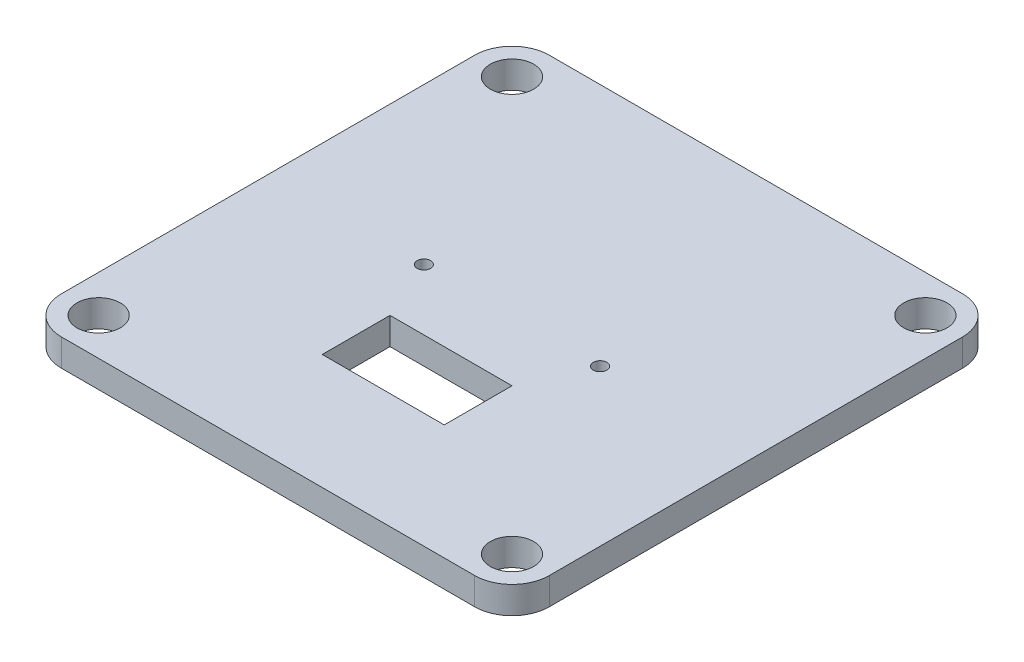
ISO-10303-21;
HEADER;
FILE_DESCRIPTION(('STEP AP214'),'2;1');
FILE_NAME('part.step','',(''),(''),'','','');
FILE_SCHEMA(('AUTOMOTIVE_DESIGN { 1 0 10303 214 1 1 1 1 }'));
ENDSEC;
DATA;
#1=APPLICATION_CONTEXT('core data for automotive mechanical design processes');
#2=APPLICATION_PROTOCOL_DEFINITION('international standard','automotive_design',2000,#1);
#3=PRODUCT_CONTEXT('',#1,'mechanical');
#4=PRODUCT('Part','Part','',(#3));
#5=PRODUCT_RELATED_PRODUCT_CATEGORY('part','',(#4));
#6=PRODUCT_DEFINITION_FORMATION('','',#4);
#7=PRODUCT_DEFINITION_CONTEXT('part definition',#1,'design');
#8=PRODUCT_DEFINITION('design','',#6,#7);
#9=PRODUCT_DEFINITION_SHAPE('','',#8);
#10=(LENGTH_UNIT() NAMED_UNIT(*) SI_UNIT(.MILLI.,.METRE.));
#11=(NAMED_UNIT(*) PLANE_ANGLE_UNIT() SI_UNIT($,.RADIAN.));
#12=(NAMED_UNIT(*) SI_UNIT($,.STERADIAN.) SOLID_ANGLE_UNIT());
#13=UNCERTAINTY_MEASURE_WITH_UNIT(LENGTH_MEASURE(1.E-05),#10,'distance_accuracy_value','');
#14=(GEOMETRIC_REPRESENTATION_CONTEXT(3) GLOBAL_UNCERTAINTY_ASSIGNED_CONTEXT((#13)) GLOBAL_UNIT_ASSIGNED_CONTEXT((#10,
#11,#12)) REPRESENTATION_CONTEXT('',''));
#15=CARTESIAN_POINT('',(0.,0.,0.));
#16=DIRECTION('',(0.,0.,1.));
#17=DIRECTION('',(1.,0.,0.));
#18=AXIS2_PLACEMENT_3D('',#15,#16,#17);
#19=CARTESIAN_POINT('',(15.25,2.,15.25));
#20=DIRECTION('',(0.,1.,0.));
#21=DIRECTION('',(0.,0.,1.));
#22=AXIS2_PLACEMENT_3D('',#19,#20,#21);
#23=PLANE('',#22);
#24=CARTESIAN_POINT('',(-15.25,2.,-15.25));
#25=DIRECTION('',(0.,1.,0.));
#26=DIRECTION('',(0.,0.,1.));
#27=AXIS2_PLACEMENT_3D('',#24,#25,#26);
#28=CIRCLE('',#27,1.6);
#29=CARTESIAN_POINT('',(-15.25,2.,-13.65));
#30=VERTEX_POINT('',#29);
#31=EDGE_CURVE('E170',#30,#30,#28,.T.);
#32=ORIENTED_EDGE('',*,*,#31,.F.);
#33=EDGE_LOOP('',(#32));
#34=FACE_BOUND('',#33,.T.);
#35=CARTESIAN_POINT('',(15.25,2.,15.25));
#36=DIRECTION('',(0.,1.,0.));
#37=DIRECTION('',(0.,0.,1.));
#38=AXIS2_PLACEMENT_3D('',#35,#36,#37);
#39=CIRCLE('',#38,1.6);
#40=CARTESIAN_POINT('',(15.25,2.,16.85));
#41=VERTEX_POINT('',#40);
#42=EDGE_CURVE('E182',#41,#41,#39,.T.);
#43=ORIENTED_EDGE('',*,*,#42,.F.);
#44=EDGE_LOOP('',(#43));
#45=FACE_BOUND('',#44,.T.);
#46=CARTESIAN_POINT('',(15.25,2.,-15.25));
#47=DIRECTION('',(0.,1.,0.));
#48=DIRECTION('',(0.,0.,1.));
#49=AXIS2_PLACEMENT_3D('',#46,#47,#48);
#50=CIRCLE('',#49,1.6);
#51=CARTESIAN_POINT('',(15.25,2.,-13.65));
#52=VERTEX_POINT('',#51);
#53=EDGE_CURVE('E194',#52,#52,#50,.T.);
#54=ORIENTED_EDGE('',*,*,#53,.F.);
#55=EDGE_LOOP('',(#54));
#56=FACE_BOUND('',#55,.T.);
#57=CARTESIAN_POINT('',(15.25,2.,15.25));
#58=DIRECTION('',(0.,1.,0.));
#59=DIRECTION('',(0.,0.,1.));
#60=AXIS2_PLACEMENT_3D('',#57,#58,#59);
#61=CIRCLE('',#60,2.75);
#62=CARTESIAN_POINT('',(15.25,2.,18.));
#63=VERTEX_POINT('',#62);
#64=CARTESIAN_POINT('',(18.,2.,15.25));
#65=VERTEX_POINT('',#64);
#66=EDGE_CURVE('E200',#63,#65,#61,.T.);
#67=ORIENTED_EDGE('',*,*,#66,.T.);
#68=DIRECTION('',(0.,0.,-1.));
#69=VECTOR('',#68,1.);
#70=CARTESIAN_POINT('',(18.,2.,15.25));
#71=LINE('',#70,#69);
#72=CARTESIAN_POINT('',(18.,2.,-15.25));
#73=VERTEX_POINT('',#72);
#74=EDGE_CURVE('E203',#65,#73,#71,.T.);
#75=ORIENTED_EDGE('',*,*,#74,.T.);
#76=CARTESIAN_POINT('',(15.25,2.,-15.25));
#77=DIRECTION('',(0.,1.,0.));
#78=DIRECTION('',(0.,0.,-1.));
#79=AXIS2_PLACEMENT_3D('',#76,#77,#78);
#80=CIRCLE('',#79,2.75);
#81=CARTESIAN_POINT('',(15.25,2.,-18.));
#82=VERTEX_POINT('',#81);
#83=EDGE_CURVE('E206',#73,#82,#80,.T.);
#84=ORIENTED_EDGE('',*,*,#83,.T.);
#85=DIRECTION('',(-1.,0.,0.));
#86=VECTOR('',#85,1.);
#87=CARTESIAN_POINT('',(-15.25,2.,-18.));
#88=LINE('',#87,#86);
#89=CARTESIAN_POINT('',(-15.25,2.,-18.));
#90=VERTEX_POINT('',#89);
#91=EDGE_CURVE('E208',#82,#90,#88,.T.);
#92=ORIENTED_EDGE('',*,*,#91,.T.);
#93=CARTESIAN_POINT('',(-15.25,2.,-15.25));
#94=DIRECTION('',(0.,1.,0.));
#95=DIRECTION('',(0.,0.,-1.));
#96=AXIS2_PLACEMENT_3D('',#93,#94,#95);
#97=CIRCLE('',#96,2.75);
#98=CARTESIAN_POINT('',(-18.,2.,-15.25));
#99=VERTEX_POINT('',#98);
#100=EDGE_CURVE('E210',#90,#99,#97,.T.);
#101=ORIENTED_EDGE('',*,*,#100,.T.);
#102=DIRECTION('',(0.,0.,1.));
#103=VECTOR('',#102,1.);
#104=CARTESIAN_POINT('',(-18.,2.,15.25));
#105=LINE('',#104,#103);
#106=CARTESIAN_POINT('',(-18.,2.,15.25));
#107=VERTEX_POINT('',#106);
#108=EDGE_CURVE('E212',#99,#107,#105,.T.);
#109=ORIENTED_EDGE('',*,*,#108,.T.);
#110=CARTESIAN_POINT('',(-15.25,2.,15.25));
#111=DIRECTION('',(0.,1.,0.));
#112=DIRECTION('',(0.,0.,-1.));
#113=AXIS2_PLACEMENT_3D('',#110,#111,#112);
#114=CIRCLE('',#113,2.75);
#115=CARTESIAN_POINT('',(-15.25,2.,18.));
#116=VERTEX_POINT('',#115);
#117=EDGE_CURVE('E214',#107,#116,#114,.T.);
#118=ORIENTED_EDGE('',*,*,#117,.T.);
#119=DIRECTION('',(1.,0.,0.));
#120=VECTOR('',#119,1.);
#121=CARTESIAN_POINT('',(-15.25,2.,18.));
#122=LINE('',#121,#120);
#123=EDGE_CURVE('E216',#116,#63,#122,.T.);
#124=ORIENTED_EDGE('',*,*,#123,.T.);
#125=EDGE_LOOP('',(#67,#75,#84,#92,#101,#109,#118,#124));
#126=FACE_BOUND('',#125,.T.);
#127=CARTESIAN_POINT('',(-6.5,2.,0.));
#128=DIRECTION('',(0.,1.,0.));
#129=DIRECTION('',(0.,0.,1.));
#130=AXIS2_PLACEMENT_3D('',#127,#128,#129);
#131=CIRCLE('',#130,0.5);
#132=CARTESIAN_POINT('',(-6.5,2.,0.500000000000005));
#133=VERTEX_POINT('',#132);
#134=EDGE_CURVE('E188',#133,#133,#131,.T.);
#135=ORIENTED_EDGE('',*,*,#134,.F.);
#136=EDGE_LOOP('',(#135));
#137=FACE_BOUND('',#136,.T.);
#138=CARTESIAN_POINT('',(-15.25,2.,15.25));
#139=DIRECTION('',(0.,1.,0.));
#140=DIRECTION('',(0.,0.,1.));
#141=AXIS2_PLACEMENT_3D('',#138,#139,#140);
#142=CIRCLE('',#141,1.6);
#143=CARTESIAN_POINT('',(-15.25,2.,16.85));
#144=VERTEX_POINT('',#143);
#145=EDGE_CURVE('E176',#144,#144,#142,.T.);
#146=ORIENTED_EDGE('',*,*,#145,.F.);
#147=EDGE_LOOP('',(#146));
#148=FACE_BOUND('',#147,.T.);
#149=CARTESIAN_POINT('',(6.5,2.,0.));
#150=DIRECTION('',(0.,1.,0.));
#151=DIRECTION('',(0.,0.,-1.));
#152=AXIS2_PLACEMENT_3D('',#149,#150,#151);
#153=CIRCLE('',#152,0.5);
#154=CARTESIAN_POINT('',(6.5,2.,-0.499999999999994));
#155=VERTEX_POINT('',#154);
#156=EDGE_CURVE('E164',#155,#155,#153,.T.);
#157=ORIENTED_EDGE('',*,*,#156,.F.);
#158=EDGE_LOOP('',(#157));
#159=FACE_BOUND('',#158,.T.);
#160=DIRECTION('',(1.,0.,0.));
#161=VECTOR('',#160,1.);
#162=CARTESIAN_POINT('',(-4.5,2.,9.50000000000001));
#163=LINE('',#162,#161);
#164=CARTESIAN_POINT('',(-4.5,2.,9.50000000000001));
#165=VERTEX_POINT('',#164);
#166=CARTESIAN_POINT('',(4.5,2.,9.50000000000001));
#167=VERTEX_POINT('',#166);
#168=EDGE_CURVE('E136',#165,#167,#163,.T.);
#169=ORIENTED_EDGE('',*,*,#168,.F.);
#170=DIRECTION('',(0.,0.,1.));
#171=VECTOR('',#170,1.);
#172=CARTESIAN_POINT('',(-4.5,2.,4.50000000000001));
#173=LINE('',#172,#171);
#174=CARTESIAN_POINT('',(-4.5,2.,4.50000000000001));
#175=VERTEX_POINT('',#174);
#176=EDGE_CURVE('E128',#175,#165,#173,.T.);
#177=ORIENTED_EDGE('',*,*,#176,.F.);
#178=DIRECTION('',(-1.,0.,0.));
#179=VECTOR('',#178,1.);
#180=CARTESIAN_POINT('',(-4.5,2.,4.50000000000001));
#181=LINE('',#180,#179);
#182=CARTESIAN_POINT('',(4.5,2.,4.50000000000001));
#183=VERTEX_POINT('',#182);
#184=EDGE_CURVE('E150',#183,#175,#181,.T.);
#185=ORIENTED_EDGE('',*,*,#184,.F.);
#186=DIRECTION('',(0.,0.,-1.));
#187=VECTOR('',#186,1.);
#188=CARTESIAN_POINT('',(4.5,2.,4.50000000000001));
#189=LINE('',#188,#187);
#190=EDGE_CURVE('E148',#167,#183,#189,.T.);
#191=ORIENTED_EDGE('',*,*,#190,.F.);
#192=EDGE_LOOP('',(#169,#177,#185,#191));
#193=FACE_BOUND('',#192,.T.);
#194=ADVANCED_FACE('F39',(#34,#45,#56,#126,#137,#148,#159,#193),#23,.T.);
#195=CARTESIAN_POINT('',(15.25,0.,15.25));
#196=DIRECTION('',(0.,1.,0.));
#197=DIRECTION('',(0.,0.,1.));
#198=AXIS2_PLACEMENT_3D('',#195,#196,#197);
#199=PLANE('',#198);
#200=CARTESIAN_POINT('',(6.5,0.,0.));
#201=DIRECTION('',(0.,1.,0.));
#202=DIRECTION('',(0.,0.,-1.));
#203=AXIS2_PLACEMENT_3D('',#200,#201,#202);
#204=CIRCLE('',#203,0.5);
#205=CARTESIAN_POINT('',(6.5,0.,-0.499999999999994));
#206=VERTEX_POINT('',#205);
#207=EDGE_CURVE('E144',#206,#206,#204,.T.);
#208=ORIENTED_EDGE('',*,*,#207,.T.);
#209=EDGE_LOOP('',(#208));
#210=FACE_BOUND('',#209,.T.);
#211=CARTESIAN_POINT('',(-15.25,0.,-15.25));
#212=DIRECTION('',(0.,1.,0.));
#213=DIRECTION('',(0.,0.,1.));
#214=AXIS2_PLACEMENT_3D('',#211,#212,#213);
#215=CIRCLE('',#214,1.6);
#216=CARTESIAN_POINT('',(-15.25,0.,-13.65));
#217=VERTEX_POINT('',#216);
#218=EDGE_CURVE('E167',#217,#217,#215,.T.);
#219=ORIENTED_EDGE('',*,*,#218,.T.);
#220=EDGE_LOOP('',(#219));
#221=FACE_BOUND('',#220,.T.);
#222=CARTESIAN_POINT('',(-15.25,0.,15.25));
#223=DIRECTION('',(0.,1.,0.));
#224=DIRECTION('',(0.,0.,1.));
#225=AXIS2_PLACEMENT_3D('',#222,#223,#224);
#226=CIRCLE('',#225,1.6);
#227=CARTESIAN_POINT('',(-15.25,0.,16.85));
#228=VERTEX_POINT('',#227);
#229=EDGE_CURVE('E173',#228,#228,#226,.T.);
#230=ORIENTED_EDGE('',*,*,#229,.T.);
#231=EDGE_LOOP('',(#230));
#232=FACE_BOUND('',#231,.T.);
#233=CARTESIAN_POINT('',(15.25,0.,15.25));
#234=DIRECTION('',(0.,1.,0.));
#235=DIRECTION('',(0.,0.,1.));
#236=AXIS2_PLACEMENT_3D('',#233,#234,#235);
#237=CIRCLE('',#236,1.6);
#238=CARTESIAN_POINT('',(15.25,0.,16.85));
#239=VERTEX_POINT('',#238);
#240=EDGE_CURVE('E179',#239,#239,#237,.T.);
#241=ORIENTED_EDGE('',*,*,#240,.T.);
#242=EDGE_LOOP('',(#241));
#243=FACE_BOUND('',#242,.T.);
#244=CARTESIAN_POINT('',(-6.5,0.,0.));
#245=DIRECTION('',(0.,1.,0.));
#246=DIRECTION('',(0.,0.,1.));
#247=AXIS2_PLACEMENT_3D('',#244,#245,#246);
#248=CIRCLE('',#247,0.5);
#249=CARTESIAN_POINT('',(-6.5,0.,0.500000000000005));
#250=VERTEX_POINT('',#249);
#251=EDGE_CURVE('E185',#250,#250,#248,.T.);
#252=ORIENTED_EDGE('',*,*,#251,.T.);
#253=EDGE_LOOP('',(#252));
#254=FACE_BOUND('',#253,.T.);
#255=CARTESIAN_POINT('',(15.25,0.,-15.25));
#256=DIRECTION('',(0.,1.,0.));
#257=DIRECTION('',(0.,0.,1.));
#258=AXIS2_PLACEMENT_3D('',#255,#256,#257);
#259=CIRCLE('',#258,1.6);
#260=CARTESIAN_POINT('',(15.25,0.,-13.65));
#261=VERTEX_POINT('',#260);
#262=EDGE_CURVE('E191',#261,#261,#259,.T.);
#263=ORIENTED_EDGE('',*,*,#262,.T.);
#264=EDGE_LOOP('',(#263));
#265=FACE_BOUND('',#264,.T.);
#266=CARTESIAN_POINT('',(15.25,0.,15.25));
#267=DIRECTION('',(0.,1.,0.));
#268=DIRECTION('',(0.,0.,1.));
#269=AXIS2_PLACEMENT_3D('',#266,#267,#268);
#270=CIRCLE('',#269,2.75);
#271=CARTESIAN_POINT('',(15.25,0.,18.));
#272=VERTEX_POINT('',#271);
#273=CARTESIAN_POINT('',(18.,0.,15.25));
#274=VERTEX_POINT('',#273);
#275=EDGE_CURVE('E197',#272,#274,#270,.T.);
#276=ORIENTED_EDGE('',*,*,#275,.F.);
#277=DIRECTION('',(1.,0.,0.));
#278=VECTOR('',#277,1.);
#279=CARTESIAN_POINT('',(-15.25,0.,18.));
#280=LINE('',#279,#278);
#281=CARTESIAN_POINT('',(-15.25,0.,18.));
#282=VERTEX_POINT('',#281);
#283=EDGE_CURVE('E204',#282,#272,#280,.T.);
#284=ORIENTED_EDGE('',*,*,#283,.F.);
#285=CARTESIAN_POINT('',(-15.25,0.,15.25));
#286=DIRECTION('',(0.,1.,0.));
#287=DIRECTION('',(0.,0.,-1.));
#288=AXIS2_PLACEMENT_3D('',#285,#286,#287);
#289=CIRCLE('',#288,2.75);
#290=CARTESIAN_POINT('',(-18.,0.,15.25));
#291=VERTEX_POINT('',#290);
#292=EDGE_CURVE('E231',#291,#282,#289,.T.);
#293=ORIENTED_EDGE('',*,*,#292,.F.);
#294=DIRECTION('',(0.,0.,1.));
#295=VECTOR('',#294,1.);
#296=CARTESIAN_POINT('',(-18.,0.,15.25));
#297=LINE('',#296,#295);
#298=CARTESIAN_POINT('',(-18.,0.,-15.25));
#299=VERTEX_POINT('',#298);
#300=EDGE_CURVE('E229',#299,#291,#297,.T.);
#301=ORIENTED_EDGE('',*,*,#300,.F.);
#302=CARTESIAN_POINT('',(-15.25,0.,-15.25));
#303=DIRECTION('',(0.,1.,0.));
#304=DIRECTION('',(0.,0.,-1.));
#305=AXIS2_PLACEMENT_3D('',#302,#303,#304);
#306=CIRCLE('',#305,2.75);
#307=CARTESIAN_POINT('',(-15.25,0.,-18.));
#308=VERTEX_POINT('',#307);
#309=EDGE_CURVE('E227',#308,#299,#306,.T.);
#310=ORIENTED_EDGE('',*,*,#309,.F.);
#311=DIRECTION('',(-1.,0.,0.));
#312=VECTOR('',#311,1.);
#313=CARTESIAN_POINT('',(-15.25,0.,-18.));
#314=LINE('',#313,#312);
#315=CARTESIAN_POINT('',(15.25,0.,-18.));
#316=VERTEX_POINT('',#315);
#317=EDGE_CURVE('E225',#316,#308,#314,.T.);
#318=ORIENTED_EDGE('',*,*,#317,.F.);
#319=CARTESIAN_POINT('',(15.25,0.,-15.25));
#320=DIRECTION('',(0.,1.,0.));
#321=DIRECTION('',(0.,0.,-1.));
#322=AXIS2_PLACEMENT_3D('',#319,#320,#321);
#323=CIRCLE('',#322,2.75);
#324=CARTESIAN_POINT('',(18.,0.,-15.25));
#325=VERTEX_POINT('',#324);
#326=EDGE_CURVE('E223',#325,#316,#323,.T.);
#327=ORIENTED_EDGE('',*,*,#326,.F.);
#328=DIRECTION('',(0.,0.,-1.));
#329=VECTOR('',#328,1.);
#330=CARTESIAN_POINT('',(18.,0.,15.25));
#331=LINE('',#330,#329);
#332=EDGE_CURVE('E221',#274,#325,#331,.T.);
#333=ORIENTED_EDGE('',*,*,#332,.F.);
#334=EDGE_LOOP('',(#276,#284,#293,#301,#310,#318,#327,#333));
#335=FACE_BOUND('',#334,.T.);
#336=DIRECTION('',(0.,0.,1.));
#337=VECTOR('',#336,1.);
#338=CARTESIAN_POINT('',(-4.5,0.,4.50000000000001));
#339=LINE('',#338,#337);
#340=CARTESIAN_POINT('',(-4.5,0.,4.50000000000001));
#341=VERTEX_POINT('',#340);
#342=CARTESIAN_POINT('',(-4.5,0.,9.50000000000001));
#343=VERTEX_POINT('',#342);
#344=EDGE_CURVE('E62',#341,#343,#339,.T.);
#345=ORIENTED_EDGE('',*,*,#344,.T.);
#346=DIRECTION('',(1.,0.,0.));
#347=VECTOR('',#346,1.);
#348=CARTESIAN_POINT('',(-4.5,0.,9.50000000000001));
#349=LINE('',#348,#347);
#350=CARTESIAN_POINT('',(4.5,0.,9.50000000000001));
#351=VERTEX_POINT('',#350);
#352=EDGE_CURVE('E143',#343,#351,#349,.T.);
#353=ORIENTED_EDGE('',*,*,#352,.T.);
#354=DIRECTION('',(0.,0.,-1.));
#355=VECTOR('',#354,1.);
#356=CARTESIAN_POINT('',(4.5,0.,4.50000000000001));
#357=LINE('',#356,#355);
#358=CARTESIAN_POINT('',(4.5,0.,4.50000000000001));
#359=VERTEX_POINT('',#358);
#360=EDGE_CURVE('E156',#351,#359,#357,.T.);
#361=ORIENTED_EDGE('',*,*,#360,.T.);
#362=DIRECTION('',(-1.,0.,0.));
#363=VECTOR('',#362,1.);
#364=CARTESIAN_POINT('',(-4.5,0.,4.50000000000001));
#365=LINE('',#364,#363);
#366=EDGE_CURVE('E137',#359,#341,#365,.T.);
#367=ORIENTED_EDGE('',*,*,#366,.T.);
#368=EDGE_LOOP('',(#345,#353,#361,#367));
#369=FACE_BOUND('',#368,.T.);
#370=ADVANCED_FACE('F261',(#210,#221,#232,#243,#254,#265,#335,#369),#199,.F.);
#371=CARTESIAN_POINT('',(15.25,2.,15.25));
#372=DIRECTION('',(0.,-1.,0.));
#373=DIRECTION('',(0.,0.,-1.));
#374=AXIS2_PLACEMENT_3D('',#371,#372,#373);
#375=CYLINDRICAL_SURFACE('',#374,2.75);
#376=ORIENTED_EDGE('',*,*,#275,.T.);
#377=DIRECTION('',(0.,-1.,0.));
#378=VECTOR('',#377,1.);
#379=CARTESIAN_POINT('',(18.,2.,15.25));
#380=LINE('',#379,#378);
#381=EDGE_CURVE('E11',#65,#274,#380,.T.);
#382=ORIENTED_EDGE('',*,*,#381,.F.);
#383=ORIENTED_EDGE('',*,*,#66,.F.);
#384=DIRECTION('',(0.,-1.,0.));
#385=VECTOR('',#384,1.);
#386=CARTESIAN_POINT('',(15.25,2.,18.));
#387=LINE('',#386,#385);
#388=EDGE_CURVE('E218',#63,#272,#387,.T.);
#389=ORIENTED_EDGE('',*,*,#388,.T.);
#390=EDGE_LOOP('',(#376,#382,#383,#389));
#391=FACE_BOUND('',#390,.T.);
#392=ADVANCED_FACE('F41',(#391),#375,.T.);
#393=CARTESIAN_POINT('',(18.,2.,15.25));
#394=DIRECTION('',(-1.,0.,0.));
#395=DIRECTION('',(0.,0.,1.));
#396=AXIS2_PLACEMENT_3D('',#393,#394,#395);
#397=PLANE('',#396);
#398=ORIENTED_EDGE('',*,*,#332,.T.);
#399=DIRECTION('',(0.,-1.,0.));
#400=VECTOR('',#399,1.);
#401=CARTESIAN_POINT('',(18.,2.,-15.25));
#402=LINE('',#401,#400);
#403=EDGE_CURVE('E47',#73,#325,#402,.T.);
#404=ORIENTED_EDGE('',*,*,#403,.F.);
#405=ORIENTED_EDGE('',*,*,#74,.F.);
#406=ORIENTED_EDGE('',*,*,#381,.T.);
#407=EDGE_LOOP('',(#398,#404,#405,#406));
#408=FACE_BOUND('',#407,.T.);
#409=ADVANCED_FACE('F279',(#408),#397,.F.);
#410=CARTESIAN_POINT('',(15.25,2.,-15.25));
#411=DIRECTION('',(0.,-1.,0.));
#412=DIRECTION('',(0.,0.,-1.));
#413=AXIS2_PLACEMENT_3D('',#410,#411,#412);
#414=CYLINDRICAL_SURFACE('',#413,2.75);
#415=ORIENTED_EDGE('',*,*,#326,.T.);
#416=DIRECTION('',(0.,-1.,0.));
#417=VECTOR('',#416,1.);
#418=CARTESIAN_POINT('',(15.25,2.,-18.));
#419=LINE('',#418,#417);
#420=EDGE_CURVE('E248',#82,#316,#419,.T.);
#421=ORIENTED_EDGE('',*,*,#420,.F.);
#422=ORIENTED_EDGE('',*,*,#83,.F.);
#423=ORIENTED_EDGE('',*,*,#403,.T.);
#424=EDGE_LOOP('',(#415,#421,#422,#423));
#425=FACE_BOUND('',#424,.T.);
#426=ADVANCED_FACE('F255',(#425),#414,.T.);
#427=CARTESIAN_POINT('',(-15.25,2.,-18.));
#428=DIRECTION('',(0.,0.,1.));
#429=DIRECTION('',(1.,0.,0.));
#430=AXIS2_PLACEMENT_3D('',#427,#428,#429);
#431=PLANE('',#430);
#432=ORIENTED_EDGE('',*,*,#317,.T.);
#433=DIRECTION('',(0.,-1.,0.));
#434=VECTOR('',#433,1.);
#435=CARTESIAN_POINT('',(-15.25,2.,-18.));
#436=LINE('',#435,#434);
#437=EDGE_CURVE('E245',#90,#308,#436,.T.);
#438=ORIENTED_EDGE('',*,*,#437,.F.);
#439=ORIENTED_EDGE('',*,*,#91,.F.);
#440=ORIENTED_EDGE('',*,*,#420,.T.);
#441=EDGE_LOOP('',(#432,#438,#439,#440));
#442=FACE_BOUND('',#441,.T.);
#443=ADVANCED_FACE('F267',(#442),#431,.F.);
#444=CARTESIAN_POINT('',(-15.25,2.,-15.25));
#445=DIRECTION('',(0.,-1.,0.));
#446=DIRECTION('',(0.,0.,-1.));
#447=AXIS2_PLACEMENT_3D('',#444,#445,#446);
#448=CYLINDRICAL_SURFACE('',#447,2.75);
#449=ORIENTED_EDGE('',*,*,#309,.T.);
#450=DIRECTION('',(0.,-1.,0.));
#451=VECTOR('',#450,1.);
#452=CARTESIAN_POINT('',(-18.,2.,-15.25));
#453=LINE('',#452,#451);
#454=EDGE_CURVE('E242',#99,#299,#453,.T.);
#455=ORIENTED_EDGE('',*,*,#454,.F.);
#456=ORIENTED_EDGE('',*,*,#100,.F.);
#457=ORIENTED_EDGE('',*,*,#437,.T.);
#458=EDGE_LOOP('',(#449,#455,#456,#457));
#459=FACE_BOUND('',#458,.T.);
#460=ADVANCED_FACE('F271',(#459),#448,.T.);
#461=CARTESIAN_POINT('',(-18.,2.,15.25));
#462=DIRECTION('',(1.,0.,0.));
#463=DIRECTION('',(0.,0.,-1.));
#464=AXIS2_PLACEMENT_3D('',#461,#462,#463);
#465=PLANE('',#464);
#466=ORIENTED_EDGE('',*,*,#300,.T.);
#467=DIRECTION('',(0.,-1.,0.));
#468=VECTOR('',#467,1.);
#469=CARTESIAN_POINT('',(-18.,2.,15.25));
#470=LINE('',#469,#468);
#471=EDGE_CURVE('E239',#107,#291,#470,.T.);
#472=ORIENTED_EDGE('',*,*,#471,.F.);
#473=ORIENTED_EDGE('',*,*,#108,.F.);
#474=ORIENTED_EDGE('',*,*,#454,.T.);
#475=EDGE_LOOP('',(#466,#472,#473,#474));
#476=FACE_BOUND('',#475,.T.);
#477=ADVANCED_FACE('F292',(#476),#465,.F.);
#478=CARTESIAN_POINT('',(-15.25,2.,15.25));
#479=DIRECTION('',(0.,-1.,0.));
#480=DIRECTION('',(0.,0.,-1.));
#481=AXIS2_PLACEMENT_3D('',#478,#479,#480);
#482=CYLINDRICAL_SURFACE('',#481,2.75);
#483=ORIENTED_EDGE('',*,*,#292,.T.);
#484=DIRECTION('',(0.,-1.,0.));
#485=VECTOR('',#484,1.);
#486=CARTESIAN_POINT('',(-15.25,2.,18.));
#487=LINE('',#486,#485);
#488=EDGE_CURVE('E236',#116,#282,#487,.T.);
#489=ORIENTED_EDGE('',*,*,#488,.F.);
#490=ORIENTED_EDGE('',*,*,#117,.F.);
#491=ORIENTED_EDGE('',*,*,#471,.T.);
#492=EDGE_LOOP('',(#483,#489,#490,#491));
#493=FACE_BOUND('',#492,.T.);
#494=ADVANCED_FACE('F290',(#493),#482,.T.);
#495=CARTESIAN_POINT('',(-15.25,2.,18.));
#496=DIRECTION('',(0.,0.,-1.));
#497=DIRECTION('',(-1.,0.,0.));
#498=AXIS2_PLACEMENT_3D('',#495,#496,#497);
#499=PLANE('',#498);
#500=ORIENTED_EDGE('',*,*,#283,.T.);
#501=ORIENTED_EDGE('',*,*,#388,.F.);
#502=ORIENTED_EDGE('',*,*,#123,.F.);
#503=ORIENTED_EDGE('',*,*,#488,.T.);
#504=EDGE_LOOP('',(#500,#501,#502,#503));
#505=FACE_BOUND('',#504,.T.);
#506=ADVANCED_FACE('F285',(#505),#499,.F.);
#507=CARTESIAN_POINT('',(15.25,2.,-15.25));
#508=DIRECTION('',(0.,-1.,0.));
#509=DIRECTION('',(0.,0.,-1.));
#510=AXIS2_PLACEMENT_3D('',#507,#508,#509);
#511=CYLINDRICAL_SURFACE('',#510,1.6);
#512=ORIENTED_EDGE('',*,*,#53,.T.);
#513=EDGE_LOOP('',(#512));
#514=FACE_BOUND('',#513,.T.);
#515=ORIENTED_EDGE('',*,*,#262,.F.);
#516=EDGE_LOOP('',(#515));
#517=FACE_BOUND('',#516,.T.);
#518=ADVANCED_FACE('F312',(#514,#517),#511,.F.);
#519=CARTESIAN_POINT('',(-6.5,2.,0.));
#520=DIRECTION('',(0.,-1.,0.));
#521=DIRECTION('',(0.,0.,-1.));
#522=AXIS2_PLACEMENT_3D('',#519,#520,#521);
#523=CYLINDRICAL_SURFACE('',#522,0.5);
#524=ORIENTED_EDGE('',*,*,#134,.T.);
#525=EDGE_LOOP('',(#524));
#526=FACE_BOUND('',#525,.T.);
#527=ORIENTED_EDGE('',*,*,#251,.F.);
#528=EDGE_LOOP('',(#527));
#529=FACE_BOUND('',#528,.T.);
#530=ADVANCED_FACE('F319',(#526,#529),#523,.F.);
#531=CARTESIAN_POINT('',(15.25,2.,15.25));
#532=DIRECTION('',(0.,-1.,0.));
#533=DIRECTION('',(0.,0.,-1.));
#534=AXIS2_PLACEMENT_3D('',#531,#532,#533);
#535=CYLINDRICAL_SURFACE('',#534,1.6);
#536=ORIENTED_EDGE('',*,*,#42,.T.);
#537=EDGE_LOOP('',(#536));
#538=FACE_BOUND('',#537,.T.);
#539=ORIENTED_EDGE('',*,*,#240,.F.);
#540=EDGE_LOOP('',(#539));
#541=FACE_BOUND('',#540,.T.);
#542=ADVANCED_FACE('F324',(#538,#541),#535,.F.);
#543=CARTESIAN_POINT('',(-15.25,2.,15.25));
#544=DIRECTION('',(0.,-1.,0.));
#545=DIRECTION('',(0.,0.,-1.));
#546=AXIS2_PLACEMENT_3D('',#543,#544,#545);
#547=CYLINDRICAL_SURFACE('',#546,1.6);
#548=ORIENTED_EDGE('',*,*,#145,.T.);
#549=EDGE_LOOP('',(#548));
#550=FACE_BOUND('',#549,.T.);
#551=ORIENTED_EDGE('',*,*,#229,.F.);
#552=EDGE_LOOP('',(#551));
#553=FACE_BOUND('',#552,.T.);
#554=ADVANCED_FACE('F334',(#550,#553),#547,.F.);
#555=CARTESIAN_POINT('',(-15.25,2.,-15.25));
#556=DIRECTION('',(0.,-1.,0.));
#557=DIRECTION('',(0.,0.,-1.));
#558=AXIS2_PLACEMENT_3D('',#555,#556,#557);
#559=CYLINDRICAL_SURFACE('',#558,1.6);
#560=ORIENTED_EDGE('',*,*,#31,.T.);
#561=EDGE_LOOP('',(#560));
#562=FACE_BOUND('',#561,.T.);
#563=ORIENTED_EDGE('',*,*,#218,.F.);
#564=EDGE_LOOP('',(#563));
#565=FACE_BOUND('',#564,.T.);
#566=ADVANCED_FACE('F341',(#562,#565),#559,.F.);
#567=CARTESIAN_POINT('',(6.5,2.,0.));
#568=DIRECTION('',(0.,-1.,0.));
#569=DIRECTION('',(0.,0.,-1.));
#570=AXIS2_PLACEMENT_3D('',#567,#568,#569);
#571=CYLINDRICAL_SURFACE('',#570,0.5);
#572=ORIENTED_EDGE('',*,*,#156,.T.);
#573=EDGE_LOOP('',(#572));
#574=FACE_BOUND('',#573,.T.);
#575=ORIENTED_EDGE('',*,*,#207,.F.);
#576=EDGE_LOOP('',(#575));
#577=FACE_BOUND('',#576,.T.);
#578=ADVANCED_FACE('F345',(#574,#577),#571,.F.);
#579=CARTESIAN_POINT('',(-4.5,2.,4.50000000000001));
#580=DIRECTION('',(1.,0.,0.));
#581=DIRECTION('',(0.,0.,-1.));
#582=AXIS2_PLACEMENT_3D('',#579,#580,#581);
#583=PLANE('',#582);
#584=ORIENTED_EDGE('',*,*,#344,.F.);
#585=DIRECTION('',(0.,-1.,0.));
#586=VECTOR('',#585,1.);
#587=CARTESIAN_POINT('',(-4.5,2.,4.50000000000001));
#588=LINE('',#587,#586);
#589=EDGE_CURVE('E132',#175,#341,#588,.T.);
#590=ORIENTED_EDGE('',*,*,#589,.F.);
#591=ORIENTED_EDGE('',*,*,#176,.T.);
#592=DIRECTION('',(0.,-1.,0.));
#593=VECTOR('',#592,1.);
#594=CARTESIAN_POINT('',(-4.5,2.,9.50000000000001));
#595=LINE('',#594,#593);
#596=EDGE_CURVE('E131',#165,#343,#595,.T.);
#597=ORIENTED_EDGE('',*,*,#596,.T.);
#598=EDGE_LOOP('',(#584,#590,#591,#597));
#599=FACE_BOUND('',#598,.T.);
#600=ADVANCED_FACE('F130',(#599),#583,.T.);
#601=CARTESIAN_POINT('',(-4.5,2.,9.50000000000001));
#602=DIRECTION('',(0.,0.,-1.));
#603=DIRECTION('',(-1.,0.,0.));
#604=AXIS2_PLACEMENT_3D('',#601,#602,#603);
#605=PLANE('',#604);
#606=ORIENTED_EDGE('',*,*,#352,.F.);
#607=ORIENTED_EDGE('',*,*,#596,.F.);
#608=ORIENTED_EDGE('',*,*,#168,.T.);
#609=DIRECTION('',(0.,-1.,0.));
#610=VECTOR('',#609,1.);
#611=CARTESIAN_POINT('',(4.5,2.,9.50000000000001));
#612=LINE('',#611,#610);
#613=EDGE_CURVE('E145',#167,#351,#612,.T.);
#614=ORIENTED_EDGE('',*,*,#613,.T.);
#615=EDGE_LOOP('',(#606,#607,#608,#614));
#616=FACE_BOUND('',#615,.T.);
#617=ADVANCED_FACE('F140',(#616),#605,.T.);
#618=CARTESIAN_POINT('',(4.5,2.,4.50000000000001));
#619=DIRECTION('',(-1.,0.,0.));
#620=DIRECTION('',(0.,0.,1.));
#621=AXIS2_PLACEMENT_3D('',#618,#619,#620);
#622=PLANE('',#621);
#623=ORIENTED_EDGE('',*,*,#360,.F.);
#624=ORIENTED_EDGE('',*,*,#613,.F.);
#625=ORIENTED_EDGE('',*,*,#190,.T.);
#626=DIRECTION('',(0.,-1.,0.));
#627=VECTOR('',#626,1.);
#628=CARTESIAN_POINT('',(4.5,2.,4.50000000000001));
#629=LINE('',#628,#627);
#630=EDGE_CURVE('E54',#183,#359,#629,.T.);
#631=ORIENTED_EDGE('',*,*,#630,.T.);
#632=EDGE_LOOP('',(#623,#624,#625,#631));
#633=FACE_BOUND('',#632,.T.);
#634=ADVANCED_FACE('F354',(#633),#622,.T.);
#635=CARTESIAN_POINT('',(-4.5,2.,4.50000000000001));
#636=DIRECTION('',(0.,0.,1.));
#637=DIRECTION('',(1.,0.,0.));
#638=AXIS2_PLACEMENT_3D('',#635,#636,#637);
#639=PLANE('',#638);
#640=ORIENTED_EDGE('',*,*,#366,.F.);
#641=ORIENTED_EDGE('',*,*,#630,.F.);
#642=ORIENTED_EDGE('',*,*,#184,.T.);
#643=ORIENTED_EDGE('',*,*,#589,.T.);
#644=EDGE_LOOP('',(#640,#641,#642,#643));
#645=FACE_BOUND('',#644,.T.);
#646=ADVANCED_FACE('F357',(#645),#639,.T.);
#647=CLOSED_SHELL('',(#194,#370,#392,#409,#426,#443,#460,#477,#494,#506,#518,#530,#542,#554,
#566,#578,#600,#617,#634,#646));
#648=MANIFOLD_SOLID_BREP('B2',#647);
#649=ADVANCED_BREP_SHAPE_REPRESENTATION('',(#18,#648),#14);
#650=SHAPE_DEFINITION_REPRESENTATION(#9,#649);
ENDSEC;
END-ISO-10303-21;
